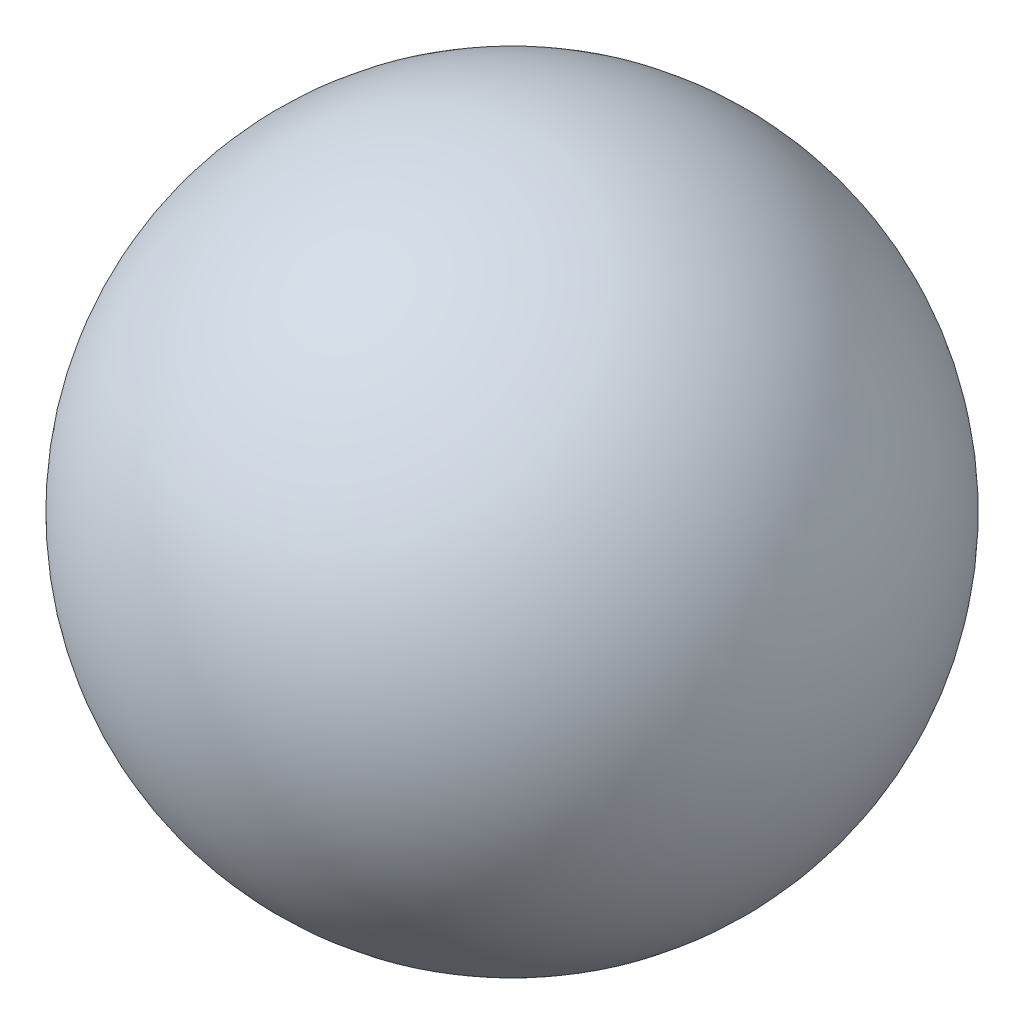
ISO-10303-21;
HEADER;
FILE_DESCRIPTION(('STEP AP214'),'2;1');
FILE_NAME('part.step','',(''),(''),'','','');
FILE_SCHEMA(('AUTOMOTIVE_DESIGN { 1 0 10303 214 1 1 1 1 }'));
ENDSEC;
DATA;
#1=APPLICATION_CONTEXT('core data for automotive mechanical design processes');
#2=APPLICATION_PROTOCOL_DEFINITION('international standard','automotive_design',2000,#1);
#3=PRODUCT_CONTEXT('',#1,'mechanical');
#4=PRODUCT('Part','Part','',(#3));
#5=PRODUCT_RELATED_PRODUCT_CATEGORY('part','',(#4));
#6=PRODUCT_DEFINITION_FORMATION('','',#4);
#7=PRODUCT_DEFINITION_CONTEXT('part definition',#1,'design');
#8=PRODUCT_DEFINITION('design','',#6,#7);
#9=PRODUCT_DEFINITION_SHAPE('','',#8);
#10=(LENGTH_UNIT() NAMED_UNIT(*) SI_UNIT(.MILLI.,.METRE.));
#11=(NAMED_UNIT(*) PLANE_ANGLE_UNIT() SI_UNIT($,.RADIAN.));
#12=(NAMED_UNIT(*) SI_UNIT($,.STERADIAN.) SOLID_ANGLE_UNIT());
#13=UNCERTAINTY_MEASURE_WITH_UNIT(LENGTH_MEASURE(1.E-05),#10,'distance_accuracy_value','');
#14=(GEOMETRIC_REPRESENTATION_CONTEXT(3) GLOBAL_UNCERTAINTY_ASSIGNED_CONTEXT((#13)) GLOBAL_UNIT_ASSIGNED_CONTEXT((#10,
#11,#12)) REPRESENTATION_CONTEXT('',''));
#15=CARTESIAN_POINT('',(0.,0.,0.));
#16=DIRECTION('',(0.,0.,1.));
#17=DIRECTION('',(1.,0.,0.));
#18=AXIS2_PLACEMENT_3D('',#15,#16,#17);
#19=CARTESIAN_POINT('',(0.,0.,0.));
#20=DIRECTION('',(0.,1.,0.));
#21=DIRECTION('',(1.,0.,0.));
#22=AXIS2_PLACEMENT_3D('',#19,#20,#21);
#23=SPHERICAL_SURFACE('',#22,88.9);
#24=CARTESIAN_POINT('',(0.,88.9,0.));
#25=VERTEX_POINT('',#24);
#26=VERTEX_LOOP('',#25);
#27=FACE_BOUND('',#26,.T.);
#28=ADVANCED_FACE('F30',(#27),#23,.T.);
#29=CLOSED_SHELL('',(#28));
#30=MANIFOLD_SOLID_BREP('B2',#29);
#31=ADVANCED_BREP_SHAPE_REPRESENTATION('',(#18,#30),#14);
#32=SHAPE_DEFINITION_REPRESENTATION(#9,#31);
ENDSEC;
END-ISO-10303-21;
